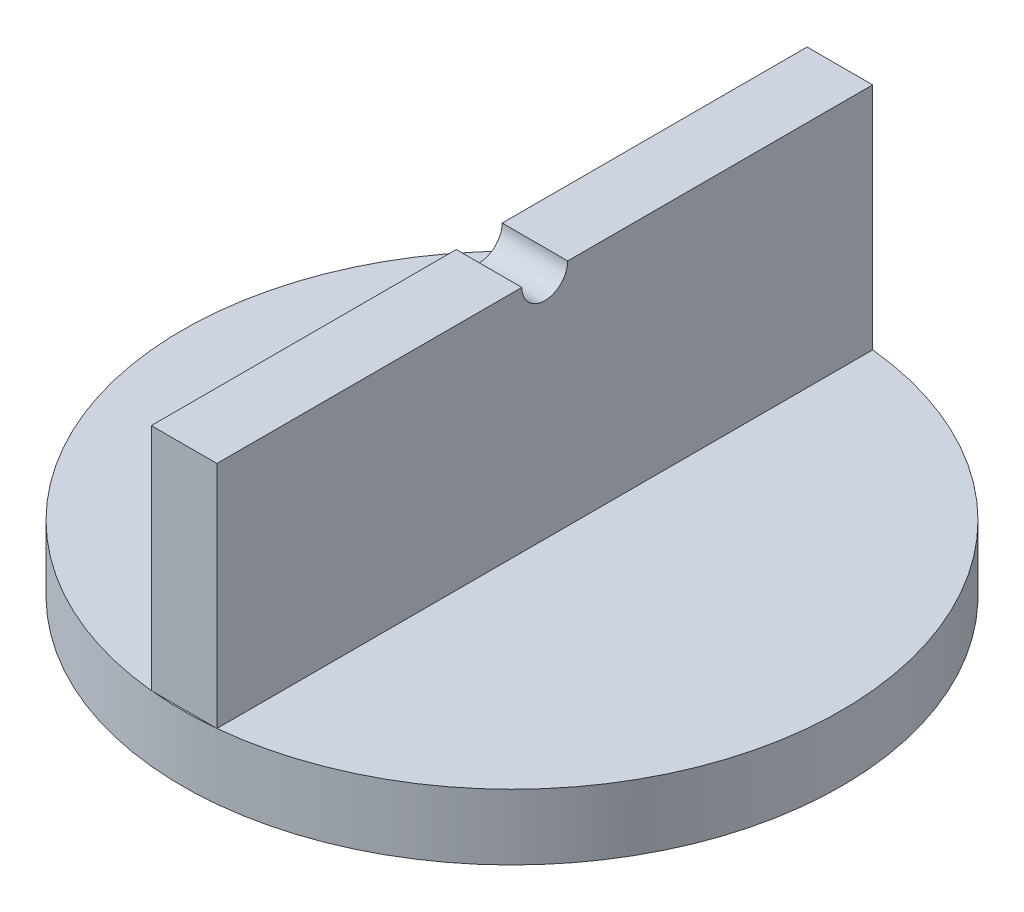
ISO-10303-21;
HEADER;
FILE_DESCRIPTION(('STEP AP214'),'2;1');
FILE_NAME('part.step','',(''),(''),'','','');
FILE_SCHEMA(('AUTOMOTIVE_DESIGN { 1 0 10303 214 1 1 1 1 }'));
ENDSEC;
DATA;
#1=APPLICATION_CONTEXT('core data for automotive mechanical design processes');
#2=APPLICATION_PROTOCOL_DEFINITION('international standard','automotive_design',2000,#1);
#3=PRODUCT_CONTEXT('',#1,'mechanical');
#4=PRODUCT('Part','Part','',(#3));
#5=PRODUCT_RELATED_PRODUCT_CATEGORY('part','',(#4));
#6=PRODUCT_DEFINITION_FORMATION('','',#4);
#7=PRODUCT_DEFINITION_CONTEXT('part definition',#1,'design');
#8=PRODUCT_DEFINITION('design','',#6,#7);
#9=PRODUCT_DEFINITION_SHAPE('','',#8);
#10=(LENGTH_UNIT() NAMED_UNIT(*) SI_UNIT(.MILLI.,.METRE.));
#11=(NAMED_UNIT(*) PLANE_ANGLE_UNIT() SI_UNIT($,.RADIAN.));
#12=(NAMED_UNIT(*) SI_UNIT($,.STERADIAN.) SOLID_ANGLE_UNIT());
#13=UNCERTAINTY_MEASURE_WITH_UNIT(LENGTH_MEASURE(1.E-05),#10,'distance_accuracy_value','');
#14=(GEOMETRIC_REPRESENTATION_CONTEXT(3) GLOBAL_UNCERTAINTY_ASSIGNED_CONTEXT((#13)) GLOBAL_UNIT_ASSIGNED_CONTEXT((#10,
#11,#12)) REPRESENTATION_CONTEXT('',''));
#15=CARTESIAN_POINT('',(0.,0.,0.));
#16=DIRECTION('',(0.,0.,1.));
#17=DIRECTION('',(1.,0.,0.));
#18=AXIS2_PLACEMENT_3D('',#15,#16,#17);
#19=CARTESIAN_POINT('',(5.,17.5,50.));
#20=DIRECTION('',(0.,0.,-1.));
#21=DIRECTION('',(0.,1.,0.));
#22=AXIS2_PLACEMENT_3D('',#19,#20,#21);
#23=PLANE('',#22);
#24=DIRECTION('',(0.,-1.,0.));
#25=VECTOR('',#24,1.);
#26=CARTESIAN_POINT('',(-5.,17.5,50.));
#27=LINE('',#26,#25);
#28=CARTESIAN_POINT('',(-5.,17.5,50.));
#29=VERTEX_POINT('',#28);
#30=CARTESIAN_POINT('',(-4.99999999999998,-17.5,50.));
#31=VERTEX_POINT('',#30);
#32=EDGE_CURVE('E115',#29,#31,#27,.T.);
#33=ORIENTED_EDGE('',*,*,#32,.T.);
#34=DIRECTION('',(-1.,0.,0.));
#35=VECTOR('',#34,1.);
#36=CARTESIAN_POINT('',(5.,-17.5,50.));
#37=LINE('',#36,#35);
#38=CARTESIAN_POINT('',(5.,-17.5,50.));
#39=VERTEX_POINT('',#38);
#40=EDGE_CURVE('E11',#39,#31,#37,.T.);
#41=ORIENTED_EDGE('',*,*,#40,.F.);
#42=DIRECTION('',(0.,-1.,0.));
#43=VECTOR('',#42,1.);
#44=CARTESIAN_POINT('',(5.,17.5,50.));
#45=LINE('',#44,#43);
#46=CARTESIAN_POINT('',(5.,17.5,50.));
#47=VERTEX_POINT('',#46);
#48=EDGE_CURVE('E82',#47,#39,#45,.T.);
#49=ORIENTED_EDGE('',*,*,#48,.F.);
#50=DIRECTION('',(-1.,0.,0.));
#51=VECTOR('',#50,1.);
#52=CARTESIAN_POINT('',(5.,17.5,50.));
#53=LINE('',#52,#51);
#54=EDGE_CURVE('E111',#47,#29,#53,.T.);
#55=ORIENTED_EDGE('',*,*,#54,.T.);
#56=EDGE_LOOP('',(#33,#41,#49,#55));
#57=FACE_BOUND('',#56,.T.);
#58=ADVANCED_FACE('F33',(#57),#23,.F.);
#59=CARTESIAN_POINT('',(5.,17.5,-50.));
#60=DIRECTION('',(0.,0.,1.));
#61=DIRECTION('',(0.,-1.,0.));
#62=AXIS2_PLACEMENT_3D('',#59,#60,#61);
#63=PLANE('',#62);
#64=DIRECTION('',(0.,1.,0.));
#65=VECTOR('',#64,1.);
#66=CARTESIAN_POINT('',(-5.,17.5,-50.));
#67=LINE('',#66,#65);
#68=CARTESIAN_POINT('',(-5.,-17.5,-50.));
#69=VERTEX_POINT('',#68);
#70=CARTESIAN_POINT('',(-5.,17.5,-50.));
#71=VERTEX_POINT('',#70);
#72=EDGE_CURVE('E122',#69,#71,#67,.T.);
#73=ORIENTED_EDGE('',*,*,#72,.T.);
#74=DIRECTION('',(-1.,0.,0.));
#75=VECTOR('',#74,1.);
#76=CARTESIAN_POINT('',(5.,17.5,-50.));
#77=LINE('',#76,#75);
#78=CARTESIAN_POINT('',(5.,17.5,-50.));
#79=VERTEX_POINT('',#78);
#80=EDGE_CURVE('E106',#79,#71,#77,.T.);
#81=ORIENTED_EDGE('',*,*,#80,.F.);
#82=DIRECTION('',(0.,1.,0.));
#83=VECTOR('',#82,1.);
#84=CARTESIAN_POINT('',(5.,17.5,-50.));
#85=LINE('',#84,#83);
#86=CARTESIAN_POINT('',(5.,-17.5,-50.));
#87=VERTEX_POINT('',#86);
#88=EDGE_CURVE('E97',#87,#79,#85,.T.);
#89=ORIENTED_EDGE('',*,*,#88,.F.);
#90=DIRECTION('',(-1.,0.,0.));
#91=VECTOR('',#90,1.);
#92=CARTESIAN_POINT('',(5.,-17.5,-50.));
#93=LINE('',#92,#91);
#94=EDGE_CURVE('E41',#87,#69,#93,.T.);
#95=ORIENTED_EDGE('',*,*,#94,.T.);
#96=EDGE_LOOP('',(#73,#81,#89,#95));
#97=FACE_BOUND('',#96,.T.);
#98=ADVANCED_FACE('F132',(#97),#63,.F.);
#99=CARTESIAN_POINT('',(5.,17.5,-50.));
#100=DIRECTION('',(0.,-1.,0.));
#101=DIRECTION('',(0.,0.,-1.));
#102=AXIS2_PLACEMENT_3D('',#99,#100,#101);
#103=PLANE('',#102);
#104=DIRECTION('',(0.,0.,1.));
#105=VECTOR('',#104,1.);
#106=CARTESIAN_POINT('',(-5.,17.5,-50.));
#107=LINE('',#106,#105);
#108=CARTESIAN_POINT('',(-5.,17.5,-3.5));
#109=VERTEX_POINT('',#108);
#110=EDGE_CURVE('E105',#71,#109,#107,.T.);
#111=ORIENTED_EDGE('',*,*,#110,.T.);
#112=DIRECTION('',(-1.,0.,0.));
#113=VECTOR('',#112,1.);
#114=CARTESIAN_POINT('',(5.,17.5,-3.5));
#115=LINE('',#114,#113);
#116=CARTESIAN_POINT('',(5.,17.5,-3.5));
#117=VERTEX_POINT('',#116);
#118=EDGE_CURVE('E102',#117,#109,#115,.T.);
#119=ORIENTED_EDGE('',*,*,#118,.F.);
#120=DIRECTION('',(0.,0.,1.));
#121=VECTOR('',#120,1.);
#122=CARTESIAN_POINT('',(5.,17.5,-50.));
#123=LINE('',#122,#121);
#124=EDGE_CURVE('E91',#79,#117,#123,.T.);
#125=ORIENTED_EDGE('',*,*,#124,.F.);
#126=ORIENTED_EDGE('',*,*,#80,.T.);
#127=EDGE_LOOP('',(#111,#119,#125,#126));
#128=FACE_BOUND('',#127,.T.);
#129=ADVANCED_FACE('F103',(#128),#103,.F.);
#130=CARTESIAN_POINT('',(5.,17.5,0.));
#131=DIRECTION('',(-1.,0.,0.));
#132=DIRECTION('',(0.,0.,1.));
#133=AXIS2_PLACEMENT_3D('',#130,#131,#132);
#134=CYLINDRICAL_SURFACE('',#133,3.5);
#135=CARTESIAN_POINT('',(-5.,17.5,0.));
#136=DIRECTION('',(-1.,0.,0.));
#137=DIRECTION('',(0.,0.,-1.));
#138=AXIS2_PLACEMENT_3D('',#135,#136,#137);
#139=CIRCLE('',#138,3.5);
#140=CARTESIAN_POINT('',(-5.,17.5,3.5));
#141=VERTEX_POINT('',#140);
#142=EDGE_CURVE('E70',#109,#141,#139,.T.);
#143=ORIENTED_EDGE('',*,*,#142,.T.);
#144=DIRECTION('',(-1.,0.,0.));
#145=VECTOR('',#144,1.);
#146=CARTESIAN_POINT('',(5.,17.5,3.5));
#147=LINE('',#146,#145);
#148=CARTESIAN_POINT('',(5.,17.5,3.5));
#149=VERTEX_POINT('',#148);
#150=EDGE_CURVE('E107',#149,#141,#147,.T.);
#151=ORIENTED_EDGE('',*,*,#150,.F.);
#152=CARTESIAN_POINT('',(5.,17.5,0.));
#153=DIRECTION('',(-1.,0.,0.));
#154=DIRECTION('',(0.,0.,-1.));
#155=AXIS2_PLACEMENT_3D('',#152,#153,#154);
#156=CIRCLE('',#155,3.5);
#157=EDGE_CURVE('E95',#117,#149,#156,.T.);
#158=ORIENTED_EDGE('',*,*,#157,.F.);
#159=ORIENTED_EDGE('',*,*,#118,.T.);
#160=EDGE_LOOP('',(#143,#151,#158,#159));
#161=FACE_BOUND('',#160,.T.);
#162=ADVANCED_FACE('F109',(#161),#134,.F.);
#163=CARTESIAN_POINT('',(5.,17.5,3.5));
#164=DIRECTION('',(0.,-1.,0.));
#165=DIRECTION('',(0.,0.,-1.));
#166=AXIS2_PLACEMENT_3D('',#163,#164,#165);
#167=PLANE('',#166);
#168=DIRECTION('',(0.,0.,1.));
#169=VECTOR('',#168,1.);
#170=CARTESIAN_POINT('',(-5.,17.5,3.5));
#171=LINE('',#170,#169);
#172=EDGE_CURVE('E76',#141,#29,#171,.T.);
#173=ORIENTED_EDGE('',*,*,#172,.T.);
#174=ORIENTED_EDGE('',*,*,#54,.F.);
#175=DIRECTION('',(0.,0.,1.));
#176=VECTOR('',#175,1.);
#177=CARTESIAN_POINT('',(5.,17.5,3.5));
#178=LINE('',#177,#176);
#179=EDGE_CURVE('E49',#149,#47,#178,.T.);
#180=ORIENTED_EDGE('',*,*,#179,.F.);
#181=ORIENTED_EDGE('',*,*,#150,.T.);
#182=EDGE_LOOP('',(#173,#174,#180,#181));
#183=FACE_BOUND('',#182,.T.);
#184=ADVANCED_FACE('F166',(#183),#167,.F.);
#185=CARTESIAN_POINT('',(5.,17.5,0.));
#186=DIRECTION('',(1.,0.,0.));
#187=DIRECTION('',(0.,0.,-1.));
#188=AXIS2_PLACEMENT_3D('',#185,#186,#187);
#189=PLANE('',#188);
#190=ORIENTED_EDGE('',*,*,#48,.T.);
#191=DIRECTION('',(0.,0.,-1.));
#192=VECTOR('',#191,1.);
#193=CARTESIAN_POINT('',(5.,-17.5,-50.));
#194=LINE('',#193,#192);
#195=EDGE_CURVE('E159',#39,#87,#194,.T.);
#196=ORIENTED_EDGE('',*,*,#195,.T.);
#197=ORIENTED_EDGE('',*,*,#88,.T.);
#198=ORIENTED_EDGE('',*,*,#124,.T.);
#199=ORIENTED_EDGE('',*,*,#157,.T.);
#200=ORIENTED_EDGE('',*,*,#179,.T.);
#201=EDGE_LOOP('',(#190,#196,#197,#198,#199,#200));
#202=FACE_BOUND('',#201,.T.);
#203=ADVANCED_FACE('F93',(#202),#189,.T.);
#204=CARTESIAN_POINT('',(-5.,17.5,0.));
#205=DIRECTION('',(1.,0.,0.));
#206=DIRECTION('',(0.,0.,-1.));
#207=AXIS2_PLACEMENT_3D('',#204,#205,#206);
#208=PLANE('',#207);
#209=ORIENTED_EDGE('',*,*,#32,.F.);
#210=ORIENTED_EDGE('',*,*,#172,.F.);
#211=ORIENTED_EDGE('',*,*,#142,.F.);
#212=ORIENTED_EDGE('',*,*,#110,.F.);
#213=ORIENTED_EDGE('',*,*,#72,.F.);
#214=DIRECTION('',(0.,0.,-1.));
#215=VECTOR('',#214,1.);
#216=CARTESIAN_POINT('',(-5.,-17.5,-50.));
#217=LINE('',#216,#215);
#218=EDGE_CURVE('E118',#31,#69,#217,.T.);
#219=ORIENTED_EDGE('',*,*,#218,.F.);
#220=EDGE_LOOP('',(#209,#210,#211,#212,#213,#219));
#221=FACE_BOUND('',#220,.T.);
#222=ADVANCED_FACE('F139',(#221),#208,.F.);
#223=CARTESIAN_POINT('',(0.,-17.5,0.));
#224=DIRECTION('',(0.,-1.,0.));
#225=DIRECTION('',(0.,0.,-1.));
#226=AXIS2_PLACEMENT_3D('',#223,#224,#225);
#227=PLANE('',#226);
#228=ORIENTED_EDGE('',*,*,#94,.F.);
#229=CARTESIAN_POINT('',(0.,-17.5,0.));
#230=DIRECTION('',(0.,-1.,0.));
#231=DIRECTION('',(0.,0.,-1.));
#232=AXIS2_PLACEMENT_3D('',#229,#230,#231);
#233=CIRCLE('',#232,50.2493781056044);
#234=EDGE_CURVE('E146',#69,#87,#233,.T.);
#235=ORIENTED_EDGE('',*,*,#234,.F.);
#236=EDGE_LOOP('',(#228,#235));
#237=FACE_BOUND('',#236,.T.);
#238=ADVANCED_FACE('F147',(#237),#227,.F.);
#239=ORIENTED_EDGE('',*,*,#195,.F.);
#240=EDGE_CURVE('E152',#87,#39,#233,.T.);
#241=ORIENTED_EDGE('',*,*,#240,.F.);
#242=EDGE_LOOP('',(#239,#241));
#243=FACE_BOUND('',#242,.T.);
#244=ADVANCED_FACE('F162',(#243),#227,.F.);
#245=EDGE_CURVE('E144',#31,#69,#233,.T.);
#246=ORIENTED_EDGE('',*,*,#245,.F.);
#247=ORIENTED_EDGE('',*,*,#218,.T.);
#248=EDGE_LOOP('',(#246,#247));
#249=FACE_BOUND('',#248,.T.);
#250=ADVANCED_FACE('F142',(#249),#227,.F.);
#251=CARTESIAN_POINT('',(0.,-27.5,0.));
#252=DIRECTION('',(0.,1.,0.));
#253=DIRECTION('',(0.,0.,1.));
#254=AXIS2_PLACEMENT_3D('',#251,#252,#253);
#255=CYLINDRICAL_SURFACE('',#254,50.2493781056044);
#256=CARTESIAN_POINT('',(0.,-27.5,0.));
#257=DIRECTION('',(0.,-1.,0.));
#258=DIRECTION('',(0.,0.,-1.));
#259=AXIS2_PLACEMENT_3D('',#256,#257,#258);
#260=CIRCLE('',#259,50.2493781056044);
#261=CARTESIAN_POINT('',(0.,-27.5,-50.2493781056044));
#262=VERTEX_POINT('',#261);
#263=EDGE_CURVE('E119',#262,#262,#260,.T.);
#264=ORIENTED_EDGE('',*,*,#263,.F.);
#265=EDGE_LOOP('',(#264));
#266=FACE_BOUND('',#265,.T.);
#267=ORIENTED_EDGE('',*,*,#240,.T.);
#268=EDGE_CURVE('E155',#39,#31,#233,.T.);
#269=ORIENTED_EDGE('',*,*,#268,.T.);
#270=ORIENTED_EDGE('',*,*,#245,.T.);
#271=ORIENTED_EDGE('',*,*,#234,.T.);
#272=EDGE_LOOP('',(#267,#269,#270,#271));
#273=FACE_BOUND('',#272,.T.);
#274=ADVANCED_FACE('F153',(#266,#273),#255,.T.);
#275=CARTESIAN_POINT('',(0.,-27.5,0.));
#276=DIRECTION('',(0.,-1.,0.));
#277=DIRECTION('',(0.,0.,-1.));
#278=AXIS2_PLACEMENT_3D('',#275,#276,#277);
#279=PLANE('',#278);
#280=ORIENTED_EDGE('',*,*,#263,.T.);
#281=EDGE_LOOP('',(#280));
#282=FACE_BOUND('',#281,.T.);
#283=ADVANCED_FACE('F246',(#282),#279,.T.);
#284=ORIENTED_EDGE('',*,*,#268,.F.);
#285=ORIENTED_EDGE('',*,*,#40,.T.);
#286=EDGE_LOOP('',(#284,#285));
#287=FACE_BOUND('',#286,.T.);
#288=ADVANCED_FACE('F164',(#287),#227,.F.);
#289=CLOSED_SHELL('',(#58,#98,#129,#162,#184,#203,#222,#238,#244,#250,#274,#283,#288));
#290=MANIFOLD_SOLID_BREP('B2',#289);
#291=ADVANCED_BREP_SHAPE_REPRESENTATION('',(#18,#290),#14);
#292=SHAPE_DEFINITION_REPRESENTATION(#9,#291);
ENDSEC;
END-ISO-10303-21;
